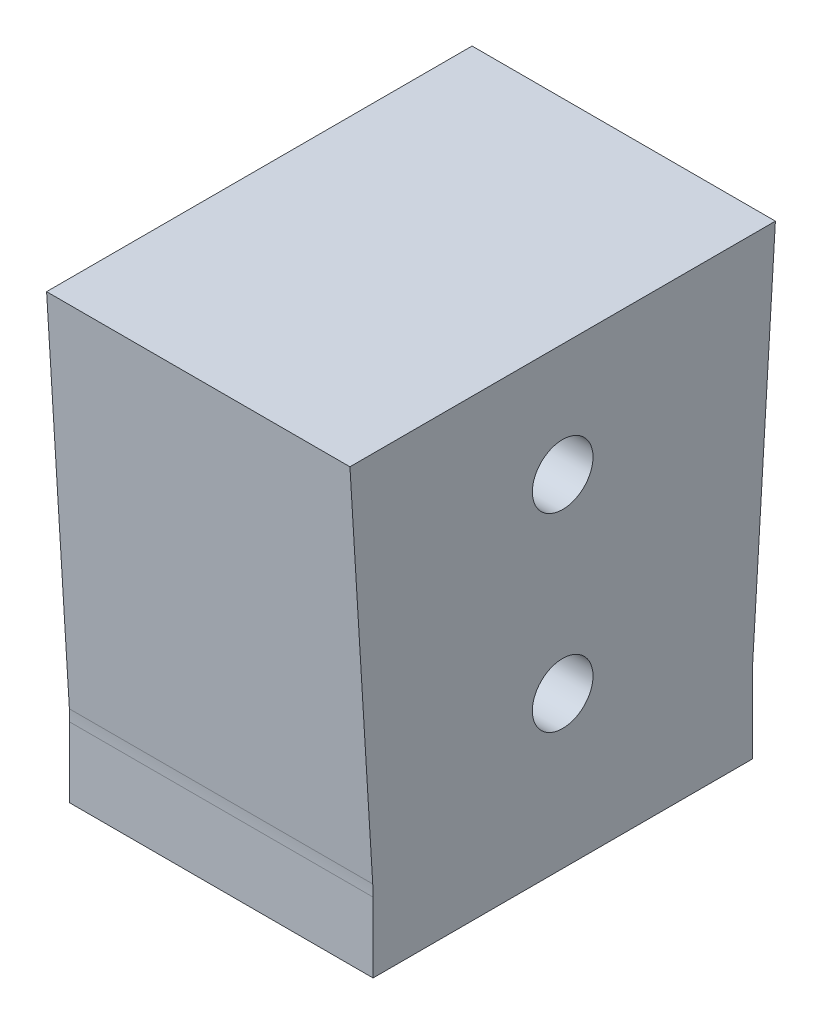
ISO-10303-21;
HEADER;
FILE_DESCRIPTION(('STEP AP214'),'2;1');
FILE_NAME('part.step','',(''),(''),'','','');
FILE_SCHEMA(('AUTOMOTIVE_DESIGN { 1 0 10303 214 1 1 1 1 }'));
ENDSEC;
DATA;
#1=APPLICATION_CONTEXT('core data for automotive mechanical design processes');
#2=APPLICATION_PROTOCOL_DEFINITION('international standard','automotive_design',2000,#1);
#3=PRODUCT_CONTEXT('',#1,'mechanical');
#4=PRODUCT('Part','Part','',(#3));
#5=PRODUCT_RELATED_PRODUCT_CATEGORY('part','',(#4));
#6=PRODUCT_DEFINITION_FORMATION('','',#4);
#7=PRODUCT_DEFINITION_CONTEXT('part definition',#1,'design');
#8=PRODUCT_DEFINITION('design','',#6,#7);
#9=PRODUCT_DEFINITION_SHAPE('','',#8);
#10=(LENGTH_UNIT() NAMED_UNIT(*) SI_UNIT(.MILLI.,.METRE.));
#11=(NAMED_UNIT(*) PLANE_ANGLE_UNIT() SI_UNIT($,.RADIAN.));
#12=(NAMED_UNIT(*) SI_UNIT($,.STERADIAN.) SOLID_ANGLE_UNIT());
#13=UNCERTAINTY_MEASURE_WITH_UNIT(LENGTH_MEASURE(1.E-05),#10,'distance_accuracy_value','');
#14=(GEOMETRIC_REPRESENTATION_CONTEXT(3) GLOBAL_UNCERTAINTY_ASSIGNED_CONTEXT((#13)) GLOBAL_UNIT_ASSIGNED_CONTEXT((#10,
#11,#12)) REPRESENTATION_CONTEXT('',''));
#15=CARTESIAN_POINT('',(0.,0.,0.));
#16=DIRECTION('',(0.,0.,1.));
#17=DIRECTION('',(1.,0.,0.));
#18=AXIS2_PLACEMENT_3D('',#15,#16,#17);
#19=CARTESIAN_POINT('',(-8.,-5.85365204708861,-10.));
#20=DIRECTION('',(1.,0.,0.));
#21=DIRECTION('',(0.,0.,-1.));
#22=AXIS2_PLACEMENT_3D('',#19,#20,#21);
#23=PLANE('',#22);
#24=CARTESIAN_POINT('',(-8.,19.1483479529114,0.));
#25=DIRECTION('',(1.,0.,0.));
#26=DIRECTION('',(0.,0.,-1.));
#27=AXIS2_PLACEMENT_3D('',#24,#25,#26);
#28=CIRCLE('',#27,1.6);
#29=CARTESIAN_POINT('',(-8.,19.1483479529114,-1.6));
#30=VERTEX_POINT('',#29);
#31=EDGE_CURVE('E130',#30,#30,#28,.T.);
#32=ORIENTED_EDGE('',*,*,#31,.T.);
#33=EDGE_LOOP('',(#32));
#34=FACE_BOUND('',#33,.T.);
#35=CARTESIAN_POINT('',(-8.,29.1483479529114,0.));
#36=DIRECTION('',(1.,0.,0.));
#37=DIRECTION('',(0.,0.,-1.));
#38=AXIS2_PLACEMENT_3D('',#35,#36,#37);
#39=CIRCLE('',#38,1.6);
#40=CARTESIAN_POINT('',(-8.,29.1483479529114,-1.6));
#41=VERTEX_POINT('',#40);
#42=EDGE_CURVE('E140',#41,#41,#39,.T.);
#43=ORIENTED_EDGE('',*,*,#42,.T.);
#44=EDGE_LOOP('',(#43));
#45=FACE_BOUND('',#44,.T.);
#46=DIRECTION('',(0.,0.998134798421867,-0.06104853953485));
#47=VECTOR('',#46,1.);
#48=CARTESIAN_POINT('',(-8.,15.1483479529114,-10.));
#49=LINE('',#48,#47);
#50=CARTESIAN_POINT('',(-8.,15.453305715274,-10.0186520157813));
#51=VERTEX_POINT('',#50);
#52=CARTESIAN_POINT('',(-8.,35.1110439213487,-11.220970790697));
#53=VERTEX_POINT('',#52);
#54=EDGE_CURVE('E145',#51,#53,#49,.T.);
#55=ORIENTED_EDGE('',*,*,#54,.F.);
#56=CARTESIAN_POINT('',(-8.,14.8428203199255,-20.));
#57=DIRECTION('',(1.,0.,0.));
#58=DIRECTION('',(0.,0.,-1.));
#59=AXIS2_PLACEMENT_3D('',#56,#57,#58);
#60=CIRCLE('',#59,10.);
#61=CARTESIAN_POINT('',(-8.,14.8428203199255,-10.));
#62=VERTEX_POINT('',#61);
#63=EDGE_CURVE('E11',#51,#62,#60,.T.);
#64=ORIENTED_EDGE('',*,*,#63,.T.);
#65=DIRECTION('',(0.,1.,0.));
#66=VECTOR('',#65,1.);
#67=CARTESIAN_POINT('',(-8.,11.1483479529114,-10.));
#68=LINE('',#67,#66);
#69=CARTESIAN_POINT('',(-8.,11.1483479529114,-10.));
#70=VERTEX_POINT('',#69);
#71=EDGE_CURVE('E113',#70,#62,#68,.T.);
#72=ORIENTED_EDGE('',*,*,#71,.F.);
#73=DIRECTION('',(0.,0.,-1.));
#74=VECTOR('',#73,1.);
#75=CARTESIAN_POINT('',(-8.,11.1483479529114,10.));
#76=LINE('',#75,#74);
#77=CARTESIAN_POINT('',(-8.,11.1483479529114,10.));
#78=VERTEX_POINT('',#77);
#79=EDGE_CURVE('E119',#78,#70,#76,.T.);
#80=ORIENTED_EDGE('',*,*,#79,.F.);
#81=DIRECTION('',(0.,1.,0.));
#82=VECTOR('',#81,1.);
#83=CARTESIAN_POINT('',(-8.,11.1483479529114,10.));
#84=LINE('',#83,#82);
#85=CARTESIAN_POINT('',(-8.,14.8428203199256,10.));
#86=VERTEX_POINT('',#85);
#87=EDGE_CURVE('E188',#78,#86,#84,.T.);
#88=ORIENTED_EDGE('',*,*,#87,.T.);
#89=CARTESIAN_POINT('',(-8.,14.8428203199256,20.));
#90=DIRECTION('',(1.,0.,0.));
#91=DIRECTION('',(0.,0.,-1.));
#92=AXIS2_PLACEMENT_3D('',#89,#90,#91);
#93=CIRCLE('',#92,10.);
#94=CARTESIAN_POINT('',(-8.,15.4533057152741,10.0186520157813));
#95=VERTEX_POINT('',#94);
#96=EDGE_CURVE('E175',#86,#95,#93,.T.);
#97=ORIENTED_EDGE('',*,*,#96,.T.);
#98=DIRECTION('',(0.,-0.998134798421867,-0.0610485395348501));
#99=VECTOR('',#98,1.);
#100=CARTESIAN_POINT('',(-8.,15.1483479529114,10.));
#101=LINE('',#100,#99);
#102=CARTESIAN_POINT('',(-8.,35.1110439213487,11.220970790697));
#103=VERTEX_POINT('',#102);
#104=EDGE_CURVE('E151',#103,#95,#101,.T.);
#105=ORIENTED_EDGE('',*,*,#104,.F.);
#106=DIRECTION('',(0.,0.,1.));
#107=VECTOR('',#106,1.);
#108=CARTESIAN_POINT('',(-8.,35.1110439213487,11.220970790697));
#109=LINE('',#108,#107);
#110=EDGE_CURVE('E158',#53,#103,#109,.T.);
#111=ORIENTED_EDGE('',*,*,#110,.F.);
#112=EDGE_LOOP('',(#55,#64,#72,#80,#88,#97,#105,#111));
#113=FACE_BOUND('',#112,.T.);
#114=ADVANCED_FACE('F45',(#34,#45,#113),#23,.F.);
#115=CARTESIAN_POINT('',(8.,-5.85365204708861,-9.99999999999999));
#116=DIRECTION('',(-1.,0.,0.));
#117=DIRECTION('',(0.,0.,1.));
#118=AXIS2_PLACEMENT_3D('',#115,#116,#117);
#119=PLANE('',#118);
#120=CARTESIAN_POINT('',(8.,19.1483479529114,0.));
#121=DIRECTION('',(1.,0.,0.));
#122=DIRECTION('',(0.,0.,-1.));
#123=AXIS2_PLACEMENT_3D('',#120,#121,#122);
#124=CIRCLE('',#123,1.6);
#125=CARTESIAN_POINT('',(8.,19.1483479529114,-1.6));
#126=VERTEX_POINT('',#125);
#127=EDGE_CURVE('E133',#126,#126,#124,.T.);
#128=ORIENTED_EDGE('',*,*,#127,.F.);
#129=EDGE_LOOP('',(#128));
#130=FACE_BOUND('',#129,.T.);
#131=CARTESIAN_POINT('',(8.,29.1483479529114,0.));
#132=DIRECTION('',(1.,0.,0.));
#133=DIRECTION('',(0.,0.,-1.));
#134=AXIS2_PLACEMENT_3D('',#131,#132,#133);
#135=CIRCLE('',#134,1.6);
#136=CARTESIAN_POINT('',(8.,29.1483479529114,-1.6));
#137=VERTEX_POINT('',#136);
#138=EDGE_CURVE('E142',#137,#137,#135,.T.);
#139=ORIENTED_EDGE('',*,*,#138,.F.);
#140=EDGE_LOOP('',(#139));
#141=FACE_BOUND('',#140,.T.);
#142=DIRECTION('',(0.,-0.998134798421867,-0.0610485395348501));
#143=VECTOR('',#142,1.);
#144=CARTESIAN_POINT('',(8.,15.1483479529114,10.));
#145=LINE('',#144,#143);
#146=CARTESIAN_POINT('',(8.,35.1110439213487,11.220970790697));
#147=VERTEX_POINT('',#146);
#148=CARTESIAN_POINT('',(8.,15.4533057152741,10.0186520157813));
#149=VERTEX_POINT('',#148);
#150=EDGE_CURVE('E153',#147,#149,#145,.T.);
#151=ORIENTED_EDGE('',*,*,#150,.T.);
#152=CARTESIAN_POINT('',(8.,14.8428203199256,20.));
#153=DIRECTION('',(-1.,0.,0.));
#154=DIRECTION('',(0.,0.,1.));
#155=AXIS2_PLACEMENT_3D('',#152,#153,#154);
#156=CIRCLE('',#155,10.);
#157=CARTESIAN_POINT('',(8.,14.8428203199256,10.));
#158=VERTEX_POINT('',#157);
#159=EDGE_CURVE('E177',#149,#158,#156,.T.);
#160=ORIENTED_EDGE('',*,*,#159,.T.);
#161=DIRECTION('',(0.,1.,0.));
#162=VECTOR('',#161,1.);
#163=CARTESIAN_POINT('',(8.,11.1483479529114,10.));
#164=LINE('',#163,#162);
#165=CARTESIAN_POINT('',(8.,11.1483479529114,10.));
#166=VERTEX_POINT('',#165);
#167=EDGE_CURVE('E135',#166,#158,#164,.T.);
#168=ORIENTED_EDGE('',*,*,#167,.F.);
#169=DIRECTION('',(0.,0.,1.));
#170=VECTOR('',#169,1.);
#171=CARTESIAN_POINT('',(8.,11.1483479529114,-10.));
#172=LINE('',#171,#170);
#173=CARTESIAN_POINT('',(8.,11.1483479529114,-10.));
#174=VERTEX_POINT('',#173);
#175=EDGE_CURVE('E118',#174,#166,#172,.T.);
#176=ORIENTED_EDGE('',*,*,#175,.F.);
#177=DIRECTION('',(0.,1.,0.));
#178=VECTOR('',#177,1.);
#179=CARTESIAN_POINT('',(8.,11.1483479529114,-10.));
#180=LINE('',#179,#178);
#181=CARTESIAN_POINT('',(8.,14.8428203199255,-10.));
#182=VERTEX_POINT('',#181);
#183=EDGE_CURVE('E115',#174,#182,#180,.T.);
#184=ORIENTED_EDGE('',*,*,#183,.T.);
#185=CARTESIAN_POINT('',(8.,14.8428203199255,-20.));
#186=DIRECTION('',(-1.,0.,0.));
#187=DIRECTION('',(0.,0.,1.));
#188=AXIS2_PLACEMENT_3D('',#185,#186,#187);
#189=CIRCLE('',#188,10.);
#190=CARTESIAN_POINT('',(8.,15.453305715274,-10.0186520157813));
#191=VERTEX_POINT('',#190);
#192=EDGE_CURVE('E53',#182,#191,#189,.T.);
#193=ORIENTED_EDGE('',*,*,#192,.T.);
#194=DIRECTION('',(0.,0.998134798421867,-0.06104853953485));
#195=VECTOR('',#194,1.);
#196=CARTESIAN_POINT('',(8.,15.1483479529114,-10.));
#197=LINE('',#196,#195);
#198=CARTESIAN_POINT('',(8.,35.1110439213487,-11.220970790697));
#199=VERTEX_POINT('',#198);
#200=EDGE_CURVE('E148',#191,#199,#197,.T.);
#201=ORIENTED_EDGE('',*,*,#200,.T.);
#202=DIRECTION('',(0.,0.,1.));
#203=VECTOR('',#202,1.);
#204=CARTESIAN_POINT('',(8.,35.1110439213487,11.220970790697));
#205=LINE('',#204,#203);
#206=EDGE_CURVE('E150',#199,#147,#205,.T.);
#207=ORIENTED_EDGE('',*,*,#206,.T.);
#208=EDGE_LOOP('',(#151,#160,#168,#176,#184,#193,#201,#207));
#209=FACE_BOUND('',#208,.T.);
#210=ADVANCED_FACE('F181',(#130,#141,#209),#119,.F.);
#211=CARTESIAN_POINT('',(8.,15.1483479529114,-10.));
#212=DIRECTION('',(0.,0.06104853953485,0.998134798421867));
#213=DIRECTION('',(0.,-0.998134798421867,0.06104853953485));
#214=AXIS2_PLACEMENT_3D('',#211,#212,#213);
#215=PLANE('',#214);
#216=ORIENTED_EDGE('',*,*,#200,.F.);
#217=DIRECTION('',(1.,0.,0.));
#218=VECTOR('',#217,1.);
#219=CARTESIAN_POINT('',(-8.,15.453305715274,-10.0186520157813));
#220=LINE('',#219,#218);
#221=EDGE_CURVE('E66',#191,#51,#220,.F.);
#222=ORIENTED_EDGE('',*,*,#221,.T.);
#223=ORIENTED_EDGE('',*,*,#54,.T.);
#224=DIRECTION('',(-1.,0.,0.));
#225=VECTOR('',#224,1.);
#226=CARTESIAN_POINT('',(8.,35.1110439213487,-11.220970790697));
#227=LINE('',#226,#225);
#228=EDGE_CURVE('E164',#199,#53,#227,.T.);
#229=ORIENTED_EDGE('',*,*,#228,.F.);
#230=EDGE_LOOP('',(#216,#222,#223,#229));
#231=FACE_BOUND('',#230,.T.);
#232=ADVANCED_FACE('F214',(#231),#215,.F.);
#233=CARTESIAN_POINT('',(8.,35.1110439213487,11.220970790697));
#234=DIRECTION('',(0.,-1.,0.));
#235=DIRECTION('',(0.,0.,-1.));
#236=AXIS2_PLACEMENT_3D('',#233,#234,#235);
#237=PLANE('',#236);
#238=ORIENTED_EDGE('',*,*,#110,.T.);
#239=DIRECTION('',(-1.,0.,0.));
#240=VECTOR('',#239,1.);
#241=CARTESIAN_POINT('',(8.,35.1110439213487,11.220970790697));
#242=LINE('',#241,#240);
#243=EDGE_CURVE('E156',#147,#103,#242,.T.);
#244=ORIENTED_EDGE('',*,*,#243,.F.);
#245=ORIENTED_EDGE('',*,*,#206,.F.);
#246=ORIENTED_EDGE('',*,*,#228,.T.);
#247=EDGE_LOOP('',(#238,#244,#245,#246));
#248=FACE_BOUND('',#247,.T.);
#249=ADVANCED_FACE('F197',(#248),#237,.F.);
#250=CARTESIAN_POINT('',(8.,15.1483479529114,10.));
#251=DIRECTION('',(0.,0.0610485395348501,-0.998134798421867));
#252=DIRECTION('',(0.,0.998134798421867,0.0610485395348501));
#253=AXIS2_PLACEMENT_3D('',#250,#251,#252);
#254=PLANE('',#253);
#255=ORIENTED_EDGE('',*,*,#104,.T.);
#256=DIRECTION('',(-1.,0.,0.));
#257=VECTOR('',#256,1.);
#258=CARTESIAN_POINT('',(8.,15.4533057152741,10.0186520157813));
#259=LINE('',#258,#257);
#260=EDGE_CURVE('E170',#95,#149,#259,.F.);
#261=ORIENTED_EDGE('',*,*,#260,.T.);
#262=ORIENTED_EDGE('',*,*,#150,.F.);
#263=ORIENTED_EDGE('',*,*,#243,.T.);
#264=EDGE_LOOP('',(#255,#261,#262,#263));
#265=FACE_BOUND('',#264,.T.);
#266=ADVANCED_FACE('F193',(#265),#254,.F.);
#267=CARTESIAN_POINT('',(8.,29.1483479529114,0.));
#268=DIRECTION('',(-1.,0.,0.));
#269=DIRECTION('',(0.,0.,1.));
#270=AXIS2_PLACEMENT_3D('',#267,#268,#269);
#271=CYLINDRICAL_SURFACE('',#270,1.6);
#272=ORIENTED_EDGE('',*,*,#138,.T.);
#273=EDGE_LOOP('',(#272));
#274=FACE_BOUND('',#273,.T.);
#275=ORIENTED_EDGE('',*,*,#42,.F.);
#276=EDGE_LOOP('',(#275));
#277=FACE_BOUND('',#276,.T.);
#278=ADVANCED_FACE('F225',(#274,#277),#271,.F.);
#279=CARTESIAN_POINT('',(8.,19.1483479529114,0.));
#280=DIRECTION('',(-1.,0.,0.));
#281=DIRECTION('',(0.,0.,1.));
#282=AXIS2_PLACEMENT_3D('',#279,#280,#281);
#283=CYLINDRICAL_SURFACE('',#282,1.6);
#284=ORIENTED_EDGE('',*,*,#127,.T.);
#285=EDGE_LOOP('',(#284));
#286=FACE_BOUND('',#285,.T.);
#287=ORIENTED_EDGE('',*,*,#31,.F.);
#288=EDGE_LOOP('',(#287));
#289=FACE_BOUND('',#288,.T.);
#290=ADVANCED_FACE('F228',(#286,#289),#283,.F.);
#291=CARTESIAN_POINT('',(-8.,11.1483479529114,-10.));
#292=DIRECTION('',(0.,0.,1.));
#293=DIRECTION('',(1.,0.,0.));
#294=AXIS2_PLACEMENT_3D('',#291,#292,#293);
#295=PLANE('',#294);
#296=ORIENTED_EDGE('',*,*,#71,.T.);
#297=DIRECTION('',(1.,0.,0.));
#298=VECTOR('',#297,1.);
#299=CARTESIAN_POINT('',(8.,14.8428203199255,-10.));
#300=LINE('',#299,#298);
#301=EDGE_CURVE('E172',#62,#182,#300,.T.);
#302=ORIENTED_EDGE('',*,*,#301,.T.);
#303=ORIENTED_EDGE('',*,*,#183,.F.);
#304=DIRECTION('',(1.,0.,0.));
#305=VECTOR('',#304,1.);
#306=CARTESIAN_POINT('',(-8.,11.1483479529114,-10.));
#307=LINE('',#306,#305);
#308=EDGE_CURVE('E108',#70,#174,#307,.T.);
#309=ORIENTED_EDGE('',*,*,#308,.F.);
#310=EDGE_LOOP('',(#296,#302,#303,#309));
#311=FACE_BOUND('',#310,.T.);
#312=ADVANCED_FACE('F110',(#311),#295,.F.);
#313=CARTESIAN_POINT('',(8.,11.1483479529114,10.));
#314=DIRECTION('',(0.,0.,-1.));
#315=DIRECTION('',(-1.,0.,0.));
#316=AXIS2_PLACEMENT_3D('',#313,#314,#315);
#317=PLANE('',#316);
#318=ORIENTED_EDGE('',*,*,#167,.T.);
#319=DIRECTION('',(-1.,0.,0.));
#320=VECTOR('',#319,1.);
#321=CARTESIAN_POINT('',(-8.,14.8428203199256,10.));
#322=LINE('',#321,#320);
#323=EDGE_CURVE('E167',#158,#86,#322,.T.);
#324=ORIENTED_EDGE('',*,*,#323,.T.);
#325=ORIENTED_EDGE('',*,*,#87,.F.);
#326=DIRECTION('',(-1.,0.,0.));
#327=VECTOR('',#326,1.);
#328=CARTESIAN_POINT('',(8.,11.1483479529114,10.));
#329=LINE('',#328,#327);
#330=EDGE_CURVE('E124',#166,#78,#329,.T.);
#331=ORIENTED_EDGE('',*,*,#330,.F.);
#332=EDGE_LOOP('',(#318,#324,#325,#331));
#333=FACE_BOUND('',#332,.T.);
#334=ADVANCED_FACE('F187',(#333),#317,.F.);
#335=CARTESIAN_POINT('',(0.,11.1483479529114,0.));
#336=DIRECTION('',(0.,-1.,0.));
#337=DIRECTION('',(0.,0.,-1.));
#338=AXIS2_PLACEMENT_3D('',#335,#336,#337);
#339=PLANE('',#338);
#340=ORIENTED_EDGE('',*,*,#79,.T.);
#341=ORIENTED_EDGE('',*,*,#308,.T.);
#342=ORIENTED_EDGE('',*,*,#175,.T.);
#343=ORIENTED_EDGE('',*,*,#330,.T.);
#344=EDGE_LOOP('',(#340,#341,#342,#343));
#345=FACE_BOUND('',#344,.T.);
#346=ADVANCED_FACE('F122',(#345),#339,.T.);
#347=CARTESIAN_POINT('',(8.,14.8428203199256,20.));
#348=DIRECTION('',(1.,0.,0.));
#349=DIRECTION('',(0.,0.,-1.));
#350=AXIS2_PLACEMENT_3D('',#347,#348,#349);
#351=CYLINDRICAL_SURFACE('',#350,10.);
#352=ORIENTED_EDGE('',*,*,#159,.F.);
#353=ORIENTED_EDGE('',*,*,#260,.F.);
#354=ORIENTED_EDGE('',*,*,#96,.F.);
#355=ORIENTED_EDGE('',*,*,#323,.F.);
#356=EDGE_LOOP('',(#352,#353,#354,#355));
#357=FACE_BOUND('',#356,.T.);
#358=ADVANCED_FACE('F189',(#357),#351,.F.);
#359=CARTESIAN_POINT('',(-8.,14.8428203199255,-20.));
#360=DIRECTION('',(-1.,0.,0.));
#361=DIRECTION('',(0.,0.,1.));
#362=AXIS2_PLACEMENT_3D('',#359,#360,#361);
#363=CYLINDRICAL_SURFACE('',#362,10.);
#364=ORIENTED_EDGE('',*,*,#63,.F.);
#365=ORIENTED_EDGE('',*,*,#221,.F.);
#366=ORIENTED_EDGE('',*,*,#192,.F.);
#367=ORIENTED_EDGE('',*,*,#301,.F.);
#368=EDGE_LOOP('',(#364,#365,#366,#367));
#369=FACE_BOUND('',#368,.T.);
#370=ADVANCED_FACE('F47',(#369),#363,.F.);
#371=CLOSED_SHELL('',(#114,#210,#232,#249,#266,#278,#290,#312,#334,#346,#358,#370));
#372=MANIFOLD_SOLID_BREP('B2',#371);
#373=ADVANCED_BREP_SHAPE_REPRESENTATION('',(#18,#372),#14);
#374=SHAPE_DEFINITION_REPRESENTATION(#9,#373);
ENDSEC;
END-ISO-10303-21;
